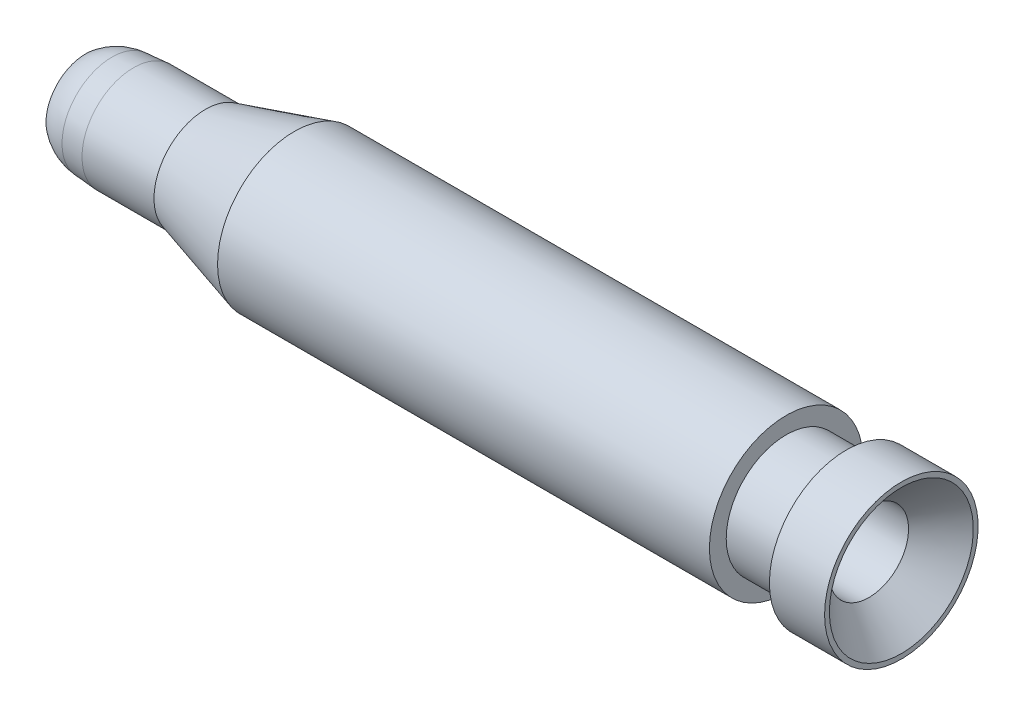
ISO-10303-21;
HEADER;
FILE_DESCRIPTION(('STEP AP214'),'2;1');
FILE_NAME('part.step','',(''),(''),'','','');
FILE_SCHEMA(('AUTOMOTIVE_DESIGN { 1 0 10303 214 1 1 1 1 }'));
ENDSEC;
DATA;
#1=APPLICATION_CONTEXT('core data for automotive mechanical design processes');
#2=APPLICATION_PROTOCOL_DEFINITION('international standard','automotive_design',2000,#1);
#3=PRODUCT_CONTEXT('',#1,'mechanical');
#4=PRODUCT('Part','Part','',(#3));
#5=PRODUCT_RELATED_PRODUCT_CATEGORY('part','',(#4));
#6=PRODUCT_DEFINITION_FORMATION('','',#4);
#7=PRODUCT_DEFINITION_CONTEXT('part definition',#1,'design');
#8=PRODUCT_DEFINITION('design','',#6,#7);
#9=PRODUCT_DEFINITION_SHAPE('','',#8);
#10=(LENGTH_UNIT() NAMED_UNIT(*) SI_UNIT(.MILLI.,.METRE.));
#11=(NAMED_UNIT(*) PLANE_ANGLE_UNIT() SI_UNIT($,.RADIAN.));
#12=(NAMED_UNIT(*) SI_UNIT($,.STERADIAN.) SOLID_ANGLE_UNIT());
#13=UNCERTAINTY_MEASURE_WITH_UNIT(LENGTH_MEASURE(1.E-05),#10,'distance_accuracy_value','');
#14=(GEOMETRIC_REPRESENTATION_CONTEXT(3) GLOBAL_UNCERTAINTY_ASSIGNED_CONTEXT((#13)) GLOBAL_UNIT_ASSIGNED_CONTEXT((#10,
#11,#12)) REPRESENTATION_CONTEXT('',''));
#15=CARTESIAN_POINT('',(0.,0.,0.));
#16=DIRECTION('',(0.,0.,1.));
#17=DIRECTION('',(1.,0.,0.));
#18=AXIS2_PLACEMENT_3D('',#15,#16,#17);
#19=CARTESIAN_POINT('',(0.,0.,0.));
#20=DIRECTION('',(-1.,0.,0.));
#21=DIRECTION('',(0.,0.,1.));
#22=AXIS2_PLACEMENT_3D('',#19,#20,#21);
#23=CYLINDRICAL_SURFACE('',#22,3.30000000000001);
#24=CARTESIAN_POINT('',(65.3,0.,0.));
#25=DIRECTION('',(-1.,0.,0.));
#26=DIRECTION('',(0.,0.,1.));
#27=AXIS2_PLACEMENT_3D('',#24,#25,#26);
#28=CIRCLE('',#27,3.30000000000001);
#29=CARTESIAN_POINT('',(65.3,0.,3.30000000000001));
#30=VERTEX_POINT('',#29);
#31=EDGE_CURVE('E10',#30,#30,#28,.F.);
#32=ORIENTED_EDGE('',*,*,#31,.T.);
#33=EDGE_LOOP('',(#32));
#34=FACE_BOUND('',#33,.T.);
#35=CARTESIAN_POINT('',(0.,0.,0.));
#36=DIRECTION('',(-1.,0.,0.));
#37=DIRECTION('',(0.,0.,1.));
#38=AXIS2_PLACEMENT_3D('',#35,#36,#37);
#39=CIRCLE('',#38,3.3);
#40=CARTESIAN_POINT('',(0.,0.,3.3));
#41=VERTEX_POINT('',#40);
#42=EDGE_CURVE('E49',#41,#41,#39,.T.);
#43=ORIENTED_EDGE('',*,*,#42,.T.);
#44=EDGE_LOOP('',(#43));
#45=FACE_BOUND('',#44,.T.);
#46=ADVANCED_FACE('F34',(#34,#45),#23,.F.);
#47=CARTESIAN_POINT('',(4.00000000000002,0.,0.));
#48=DIRECTION('',(1.,0.,0.));
#49=DIRECTION('',(0.,0.,-1.));
#50=AXIS2_PLACEMENT_3D('',#47,#48,#49);
#51=CONICAL_SURFACE('',#50,4.3,0.0748598477107673);
#52=CARTESIAN_POINT('',(2.19913690297447,0.,0.));
#53=DIRECTION('',(-1.,0.,0.));
#54=DIRECTION('',(0.,0.,1.));
#55=AXIS2_PLACEMENT_3D('',#52,#53,#54);
#56=CIRCLE('',#55,4.16493526772308);
#57=CARTESIAN_POINT('',(2.19913690297447,0.,4.16493526772308));
#58=VERTEX_POINT('',#57);
#59=EDGE_CURVE('E45',#58,#58,#56,.F.);
#60=ORIENTED_EDGE('',*,*,#59,.T.);
#61=EDGE_LOOP('',(#60));
#62=FACE_BOUND('',#61,.T.);
#63=CARTESIAN_POINT('',(4.00000000000002,0.,0.));
#64=DIRECTION('',(-1.,0.,0.));
#65=DIRECTION('',(0.,0.,1.));
#66=AXIS2_PLACEMENT_3D('',#63,#64,#65);
#67=CIRCLE('',#66,4.3);
#68=CARTESIAN_POINT('',(4.00000000000002,0.,4.3));
#69=VERTEX_POINT('',#68);
#70=EDGE_CURVE('E54',#69,#69,#67,.T.);
#71=ORIENTED_EDGE('',*,*,#70,.T.);
#72=EDGE_LOOP('',(#71));
#73=FACE_BOUND('',#72,.T.);
#74=ADVANCED_FACE('F94',(#62,#73),#51,.T.);
#75=CARTESIAN_POINT('',(0.,0.,0.));
#76=DIRECTION('',(-1.,0.,0.));
#77=DIRECTION('',(0.,0.,1.));
#78=AXIS2_PLACEMENT_3D('',#75,#76,#77);
#79=CYLINDRICAL_SURFACE('',#78,4.3);
#80=ORIENTED_EDGE('',*,*,#70,.F.);
#81=EDGE_LOOP('',(#80));
#82=FACE_BOUND('',#81,.T.);
#83=CARTESIAN_POINT('',(10.,0.,0.));
#84=DIRECTION('',(-1.,0.,0.));
#85=DIRECTION('',(0.,0.,1.));
#86=AXIS2_PLACEMENT_3D('',#83,#84,#85);
#87=CIRCLE('',#86,4.3);
#88=CARTESIAN_POINT('',(10.,0.,4.3));
#89=VERTEX_POINT('',#88);
#90=EDGE_CURVE('E57',#89,#89,#87,.T.);
#91=ORIENTED_EDGE('',*,*,#90,.T.);
#92=EDGE_LOOP('',(#91));
#93=FACE_BOUND('',#92,.T.);
#94=ADVANCED_FACE('F99',(#82,#93),#79,.T.);
#95=CARTESIAN_POINT('',(17.4,0.,0.));
#96=DIRECTION('',(1.,0.,0.));
#97=DIRECTION('',(0.,0.,-1.));
#98=AXIS2_PLACEMENT_3D('',#95,#96,#97);
#99=CONICAL_SURFACE('',#98,6.4,0.276513946617474);
#100=ORIENTED_EDGE('',*,*,#90,.F.);
#101=EDGE_LOOP('',(#100));
#102=FACE_BOUND('',#101,.T.);
#103=CARTESIAN_POINT('',(17.4,0.,0.));
#104=DIRECTION('',(-1.,0.,0.));
#105=DIRECTION('',(0.,0.,1.));
#106=AXIS2_PLACEMENT_3D('',#103,#104,#105);
#107=CIRCLE('',#106,6.4);
#108=CARTESIAN_POINT('',(17.4,0.,6.4));
#109=VERTEX_POINT('',#108);
#110=EDGE_CURVE('E60',#109,#109,#107,.T.);
#111=ORIENTED_EDGE('',*,*,#110,.T.);
#112=EDGE_LOOP('',(#111));
#113=FACE_BOUND('',#112,.T.);
#114=ADVANCED_FACE('F106',(#102,#113),#99,.T.);
#115=CARTESIAN_POINT('',(0.,0.,0.));
#116=DIRECTION('',(-1.,0.,0.));
#117=DIRECTION('',(0.,0.,1.));
#118=AXIS2_PLACEMENT_3D('',#115,#116,#117);
#119=CYLINDRICAL_SURFACE('',#118,6.4);
#120=ORIENTED_EDGE('',*,*,#110,.F.);
#121=EDGE_LOOP('',(#120));
#122=FACE_BOUND('',#121,.T.);
#123=CARTESIAN_POINT('',(58.4,0.,0.));
#124=DIRECTION('',(-1.,0.,0.));
#125=DIRECTION('',(0.,0.,1.));
#126=AXIS2_PLACEMENT_3D('',#123,#124,#125);
#127=CIRCLE('',#126,6.4);
#128=CARTESIAN_POINT('',(58.4,0.,6.4));
#129=VERTEX_POINT('',#128);
#130=EDGE_CURVE('E63',#129,#129,#127,.T.);
#131=ORIENTED_EDGE('',*,*,#130,.T.);
#132=EDGE_LOOP('',(#131));
#133=FACE_BOUND('',#132,.T.);
#134=ADVANCED_FACE('F110',(#122,#133),#119,.T.);
#135=CARTESIAN_POINT('',(58.4,6.4,0.));
#136=DIRECTION('',(-1.,0.,0.));
#137=DIRECTION('',(0.,0.,1.));
#138=AXIS2_PLACEMENT_3D('',#135,#136,#137);
#139=PLANE('',#138);
#140=ORIENTED_EDGE('',*,*,#130,.F.);
#141=EDGE_LOOP('',(#140));
#142=FACE_BOUND('',#141,.T.);
#143=CARTESIAN_POINT('',(58.4,0.,0.));
#144=DIRECTION('',(-1.,0.,0.));
#145=DIRECTION('',(0.,0.,1.));
#146=AXIS2_PLACEMENT_3D('',#143,#144,#145);
#147=CIRCLE('',#146,5.);
#148=CARTESIAN_POINT('',(58.4,0.,5.));
#149=VERTEX_POINT('',#148);
#150=EDGE_CURVE('E66',#149,#149,#147,.T.);
#151=ORIENTED_EDGE('',*,*,#150,.T.);
#152=EDGE_LOOP('',(#151));
#153=FACE_BOUND('',#152,.T.);
#154=ADVANCED_FACE('F114',(#142,#153),#139,.F.);
#155=CARTESIAN_POINT('',(0.,0.,0.));
#156=DIRECTION('',(-1.,0.,0.));
#157=DIRECTION('',(0.,0.,1.));
#158=AXIS2_PLACEMENT_3D('',#155,#156,#157);
#159=CYLINDRICAL_SURFACE('',#158,5.);
#160=ORIENTED_EDGE('',*,*,#150,.F.);
#161=EDGE_LOOP('',(#160));
#162=FACE_BOUND('',#161,.T.);
#163=CARTESIAN_POINT('',(63.4,0.,0.));
#164=DIRECTION('',(-1.,0.,0.));
#165=DIRECTION('',(0.,0.,1.));
#166=AXIS2_PLACEMENT_3D('',#163,#164,#165);
#167=CIRCLE('',#166,5.);
#168=CARTESIAN_POINT('',(63.4,0.,5.));
#169=VERTEX_POINT('',#168);
#170=EDGE_CURVE('E69',#169,#169,#167,.T.);
#171=ORIENTED_EDGE('',*,*,#170,.T.);
#172=EDGE_LOOP('',(#171));
#173=FACE_BOUND('',#172,.T.);
#174=ADVANCED_FACE('F118',(#162,#173),#159,.T.);
#175=CARTESIAN_POINT('',(63.4,5.,0.));
#176=DIRECTION('',(1.,0.,0.));
#177=DIRECTION('',(0.,0.,-1.));
#178=AXIS2_PLACEMENT_3D('',#175,#176,#177);
#179=PLANE('',#178);
#180=ORIENTED_EDGE('',*,*,#170,.F.);
#181=EDGE_LOOP('',(#180));
#182=FACE_BOUND('',#181,.T.);
#183=CARTESIAN_POINT('',(63.4,0.,0.));
#184=DIRECTION('',(-1.,0.,0.));
#185=DIRECTION('',(0.,0.,1.));
#186=AXIS2_PLACEMENT_3D('',#183,#184,#185);
#187=CIRCLE('',#186,6.4);
#188=CARTESIAN_POINT('',(63.4,0.,6.4));
#189=VERTEX_POINT('',#188);
#190=EDGE_CURVE('E72',#189,#189,#187,.T.);
#191=ORIENTED_EDGE('',*,*,#190,.T.);
#192=EDGE_LOOP('',(#191));
#193=FACE_BOUND('',#192,.T.);
#194=ADVANCED_FACE('F90',(#182,#193),#179,.F.);
#195=CARTESIAN_POINT('',(0.,0.,0.));
#196=DIRECTION('',(-1.,0.,0.));
#197=DIRECTION('',(0.,0.,1.));
#198=AXIS2_PLACEMENT_3D('',#195,#196,#197);
#199=CYLINDRICAL_SURFACE('',#198,6.4);
#200=ORIENTED_EDGE('',*,*,#190,.F.);
#201=EDGE_LOOP('',(#200));
#202=FACE_BOUND('',#201,.T.);
#203=CARTESIAN_POINT('',(68.,0.,0.));
#204=DIRECTION('',(-1.,0.,0.));
#205=DIRECTION('',(0.,0.,1.));
#206=AXIS2_PLACEMENT_3D('',#203,#204,#205);
#207=CIRCLE('',#206,6.4);
#208=CARTESIAN_POINT('',(68.,0.,6.4));
#209=VERTEX_POINT('',#208);
#210=EDGE_CURVE('E75',#209,#209,#207,.T.);
#211=ORIENTED_EDGE('',*,*,#210,.T.);
#212=EDGE_LOOP('',(#211));
#213=FACE_BOUND('',#212,.T.);
#214=ADVANCED_FACE('F79',(#202,#213),#199,.T.);
#215=CARTESIAN_POINT('',(68.,6.4,0.));
#216=DIRECTION('',(-1.,0.,0.));
#217=DIRECTION('',(0.,0.,1.));
#218=AXIS2_PLACEMENT_3D('',#215,#216,#217);
#219=PLANE('',#218);
#220=CARTESIAN_POINT('',(68.,0.,0.));
#221=DIRECTION('',(-1.,0.,0.));
#222=DIRECTION('',(0.,0.,1.));
#223=AXIS2_PLACEMENT_3D('',#220,#221,#222);
#224=CIRCLE('',#223,6.00000000000001);
#225=CARTESIAN_POINT('',(68.,0.,6.00000000000001));
#226=VERTEX_POINT('',#225);
#227=EDGE_CURVE('E41',#226,#226,#224,.T.);
#228=ORIENTED_EDGE('',*,*,#227,.T.);
#229=EDGE_LOOP('',(#228));
#230=FACE_BOUND('',#229,.T.);
#231=ORIENTED_EDGE('',*,*,#210,.F.);
#232=EDGE_LOOP('',(#231));
#233=FACE_BOUND('',#232,.T.);
#234=ADVANCED_FACE('F81',(#230,#233),#219,.F.);
#235=CARTESIAN_POINT('',(2.49829669594101,0.,0.));
#236=DIRECTION('',(-1.,0.,0.));
#237=DIRECTION('',(0.,0.,1.));
#238=AXIS2_PLACEMENT_3D('',#235,#236,#237);
#239=DEGENERATE_TOROIDAL_SURFACE('',#238,0.176138028169259,4.,.T.);
#240=ORIENTED_EDGE('',*,*,#59,.F.);
#241=EDGE_LOOP('',(#240));
#242=FACE_BOUND('',#241,.T.);
#243=ORIENTED_EDGE('',*,*,#42,.F.);
#244=EDGE_LOOP('',(#243));
#245=FACE_BOUND('',#244,.T.);
#246=ADVANCED_FACE('F83',(#242,#245),#239,.T.);
#247=CARTESIAN_POINT('',(68.,0.,0.));
#248=DIRECTION('',(1.,0.,0.));
#249=DIRECTION('',(0.,0.,-1.));
#250=AXIS2_PLACEMENT_3D('',#247,#248,#249);
#251=CONICAL_SURFACE('',#250,6.00000000000001,0.785398163397444);
#252=ORIENTED_EDGE('',*,*,#31,.F.);
#253=EDGE_LOOP('',(#252));
#254=FACE_BOUND('',#253,.T.);
#255=ORIENTED_EDGE('',*,*,#227,.F.);
#256=EDGE_LOOP('',(#255));
#257=FACE_BOUND('',#256,.T.);
#258=ADVANCED_FACE('F36',(#254,#257),#251,.F.);
#259=CLOSED_SHELL('',(#46,#74,#94,#114,#134,#154,#174,#194,#214,#234,#246,#258));
#260=MANIFOLD_SOLID_BREP('B2',#259);
#261=ADVANCED_BREP_SHAPE_REPRESENTATION('',(#18,#260),#14);
#262=SHAPE_DEFINITION_REPRESENTATION(#9,#261);
ENDSEC;
END-ISO-10303-21;
